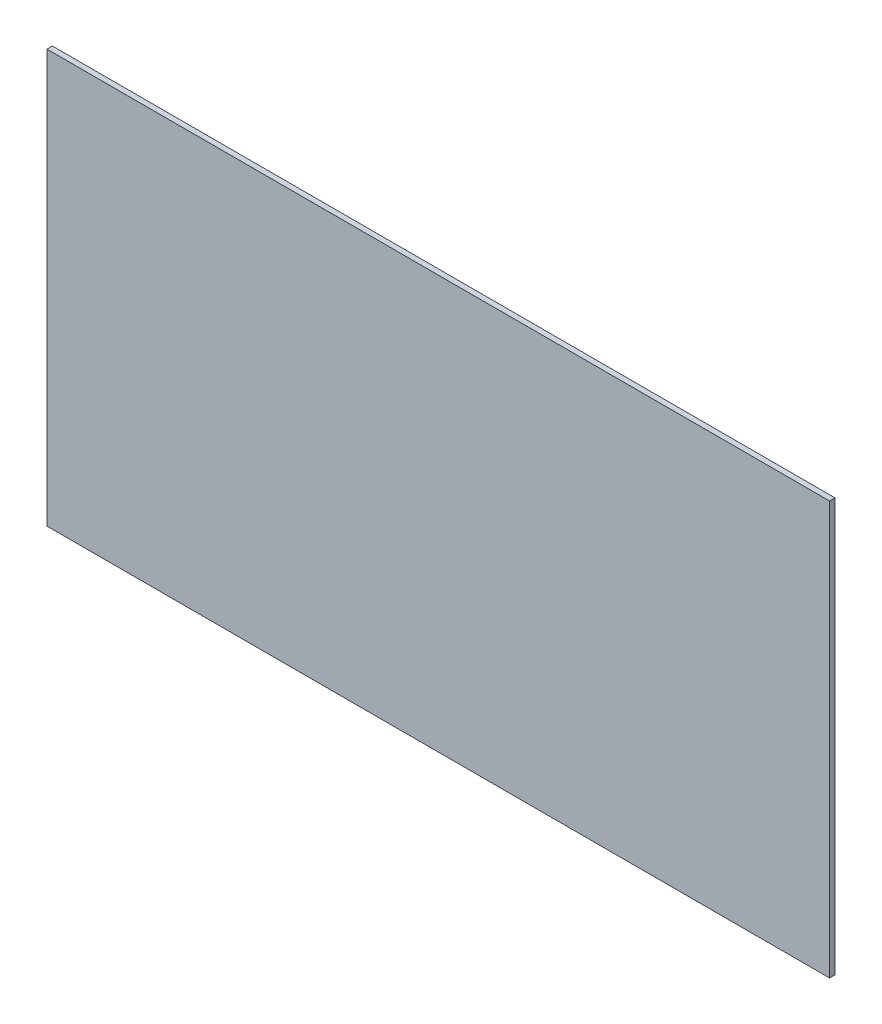
ISO-10303-21;
HEADER;
FILE_DESCRIPTION(('STEP AP214'),'2;1');
FILE_NAME('part.step','',(''),(''),'','','');
FILE_SCHEMA(('AUTOMOTIVE_DESIGN { 1 0 10303 214 1 1 1 1 }'));
ENDSEC;
DATA;
#1=APPLICATION_CONTEXT('core data for automotive mechanical design processes');
#2=APPLICATION_PROTOCOL_DEFINITION('international standard','automotive_design',2000,#1);
#3=PRODUCT_CONTEXT('',#1,'mechanical');
#4=PRODUCT('Part','Part','',(#3));
#5=PRODUCT_RELATED_PRODUCT_CATEGORY('part','',(#4));
#6=PRODUCT_DEFINITION_FORMATION('','',#4);
#7=PRODUCT_DEFINITION_CONTEXT('part definition',#1,'design');
#8=PRODUCT_DEFINITION('design','',#6,#7);
#9=PRODUCT_DEFINITION_SHAPE('','',#8);
#10=(LENGTH_UNIT() NAMED_UNIT(*) SI_UNIT(.MILLI.,.METRE.));
#11=(NAMED_UNIT(*) PLANE_ANGLE_UNIT() SI_UNIT($,.RADIAN.));
#12=(NAMED_UNIT(*) SI_UNIT($,.STERADIAN.) SOLID_ANGLE_UNIT());
#13=UNCERTAINTY_MEASURE_WITH_UNIT(LENGTH_MEASURE(1.E-05),#10,'distance_accuracy_value','');
#14=(GEOMETRIC_REPRESENTATION_CONTEXT(3) GLOBAL_UNCERTAINTY_ASSIGNED_CONTEXT((#13)) GLOBAL_UNIT_ASSIGNED_CONTEXT((#10,
#11,#12)) REPRESENTATION_CONTEXT('',''));
#15=CARTESIAN_POINT('',(0.,0.,0.));
#16=DIRECTION('',(0.,0.,1.));
#17=DIRECTION('',(1.,0.,0.));
#18=AXIS2_PLACEMENT_3D('',#15,#16,#17);
#19=CARTESIAN_POINT('',(0.,0.,6.35));
#20=DIRECTION('',(0.,0.,1.));
#21=DIRECTION('',(1.,0.,0.));
#22=AXIS2_PLACEMENT_3D('',#19,#20,#21);
#23=PLANE('',#22);
#24=DIRECTION('',(1.,0.,0.));
#25=VECTOR('',#24,1.);
#26=CARTESIAN_POINT('',(914.4,482.6,6.35));
#27=LINE('',#26,#25);
#28=CARTESIAN_POINT('',(0.,482.6,6.35));
#29=VERTEX_POINT('',#28);
#30=CARTESIAN_POINT('',(914.4,482.6,6.35));
#31=VERTEX_POINT('',#30);
#32=EDGE_CURVE('E74',#29,#31,#27,.T.);
#33=ORIENTED_EDGE('',*,*,#32,.F.);
#34=DIRECTION('',(0.,1.,0.));
#35=VECTOR('',#34,1.);
#36=CARTESIAN_POINT('',(0.,482.6,6.35));
#37=LINE('',#36,#35);
#38=CARTESIAN_POINT('',(0.,0.,6.35));
#39=VERTEX_POINT('',#38);
#40=EDGE_CURVE('E69',#39,#29,#37,.T.);
#41=ORIENTED_EDGE('',*,*,#40,.F.);
#42=DIRECTION('',(1.,0.,0.));
#43=VECTOR('',#42,1.);
#44=CARTESIAN_POINT('',(0.,0.,6.35));
#45=LINE('',#44,#43);
#46=CARTESIAN_POINT('',(914.4,0.,6.35));
#47=VERTEX_POINT('',#46);
#48=EDGE_CURVE('E84',#47,#39,#45,.F.);
#49=ORIENTED_EDGE('',*,*,#48,.F.);
#50=DIRECTION('',(0.,1.,0.));
#51=VECTOR('',#50,1.);
#52=CARTESIAN_POINT('',(914.4,0.,6.35));
#53=LINE('',#52,#51);
#54=EDGE_CURVE('E36',#31,#47,#53,.F.);
#55=ORIENTED_EDGE('',*,*,#54,.F.);
#56=EDGE_LOOP('',(#33,#41,#49,#55));
#57=FACE_BOUND('',#56,.T.);
#58=ADVANCED_FACE('F33',(#57),#23,.T.);
#59=CARTESIAN_POINT('',(914.4,0.,0.));
#60=DIRECTION('',(1.,0.,0.));
#61=DIRECTION('',(0.,0.,-1.));
#62=AXIS2_PLACEMENT_3D('',#59,#60,#61);
#63=PLANE('',#62);
#64=ORIENTED_EDGE('',*,*,#54,.T.);
#65=DIRECTION('',(0.,0.,-1.));
#66=VECTOR('',#65,1.);
#67=CARTESIAN_POINT('',(914.4,0.,0.));
#68=LINE('',#67,#66);
#69=CARTESIAN_POINT('',(914.4,0.,0.));
#70=VERTEX_POINT('',#69);
#71=EDGE_CURVE('E95',#70,#47,#68,.F.);
#72=ORIENTED_EDGE('',*,*,#71,.F.);
#73=DIRECTION('',(0.,1.,0.));
#74=VECTOR('',#73,1.);
#75=CARTESIAN_POINT('',(914.4,0.,0.));
#76=LINE('',#75,#74);
#77=CARTESIAN_POINT('',(914.4,482.6,0.));
#78=VERTEX_POINT('',#77);
#79=EDGE_CURVE('E90',#70,#78,#76,.T.);
#80=ORIENTED_EDGE('',*,*,#79,.T.);
#81=DIRECTION('',(0.,0.,1.));
#82=VECTOR('',#81,1.);
#83=CARTESIAN_POINT('',(914.4,482.6,0.));
#84=LINE('',#83,#82);
#85=EDGE_CURVE('E79',#31,#78,#84,.F.);
#86=ORIENTED_EDGE('',*,*,#85,.F.);
#87=EDGE_LOOP('',(#64,#72,#80,#86));
#88=FACE_BOUND('',#87,.T.);
#89=ADVANCED_FACE('F89',(#88),#63,.T.);
#90=CARTESIAN_POINT('',(914.4,482.6,0.));
#91=DIRECTION('',(0.,1.,0.));
#92=DIRECTION('',(0.,0.,1.));
#93=AXIS2_PLACEMENT_3D('',#90,#91,#92);
#94=PLANE('',#93);
#95=ORIENTED_EDGE('',*,*,#32,.T.);
#96=ORIENTED_EDGE('',*,*,#85,.T.);
#97=DIRECTION('',(1.,0.,0.));
#98=VECTOR('',#97,1.);
#99=CARTESIAN_POINT('',(0.,482.6,0.));
#100=LINE('',#99,#98);
#101=CARTESIAN_POINT('',(0.,482.6,0.));
#102=VERTEX_POINT('',#101);
#103=EDGE_CURVE('E100',#78,#102,#100,.F.);
#104=ORIENTED_EDGE('',*,*,#103,.T.);
#105=DIRECTION('',(0.,0.,1.));
#106=VECTOR('',#105,1.);
#107=CARTESIAN_POINT('',(0.,482.6,0.));
#108=LINE('',#107,#106);
#109=EDGE_CURVE('E81',#29,#102,#108,.F.);
#110=ORIENTED_EDGE('',*,*,#109,.F.);
#111=EDGE_LOOP('',(#95,#96,#104,#110));
#112=FACE_BOUND('',#111,.T.);
#113=ADVANCED_FACE('F76',(#112),#94,.T.);
#114=CARTESIAN_POINT('',(0.,482.6,0.));
#115=DIRECTION('',(-1.,0.,0.));
#116=DIRECTION('',(0.,0.,1.));
#117=AXIS2_PLACEMENT_3D('',#114,#115,#116);
#118=PLANE('',#117);
#119=ORIENTED_EDGE('',*,*,#40,.T.);
#120=ORIENTED_EDGE('',*,*,#109,.T.);
#121=DIRECTION('',(0.,1.,0.));
#122=VECTOR('',#121,1.);
#123=CARTESIAN_POINT('',(0.,0.,0.));
#124=LINE('',#123,#122);
#125=CARTESIAN_POINT('',(0.,0.,0.));
#126=VERTEX_POINT('',#125);
#127=EDGE_CURVE('E42',#102,#126,#124,.F.);
#128=ORIENTED_EDGE('',*,*,#127,.T.);
#129=DIRECTION('',(0.,0.,-1.));
#130=VECTOR('',#129,1.);
#131=CARTESIAN_POINT('',(0.,0.,0.));
#132=LINE('',#131,#130);
#133=EDGE_CURVE('E50',#39,#126,#132,.T.);
#134=ORIENTED_EDGE('',*,*,#133,.F.);
#135=EDGE_LOOP('',(#119,#120,#128,#134));
#136=FACE_BOUND('',#135,.T.);
#137=ADVANCED_FACE('F104',(#136),#118,.T.);
#138=CARTESIAN_POINT('',(0.,0.,0.));
#139=DIRECTION('',(0.,-1.,0.));
#140=DIRECTION('',(0.,0.,-1.));
#141=AXIS2_PLACEMENT_3D('',#138,#139,#140);
#142=PLANE('',#141);
#143=ORIENTED_EDGE('',*,*,#48,.T.);
#144=ORIENTED_EDGE('',*,*,#133,.T.);
#145=DIRECTION('',(1.,0.,0.));
#146=VECTOR('',#145,1.);
#147=CARTESIAN_POINT('',(0.,0.,0.));
#148=LINE('',#147,#146);
#149=EDGE_CURVE('E11',#126,#70,#148,.T.);
#150=ORIENTED_EDGE('',*,*,#149,.T.);
#151=ORIENTED_EDGE('',*,*,#71,.T.);
#152=EDGE_LOOP('',(#143,#144,#150,#151));
#153=FACE_BOUND('',#152,.T.);
#154=ADVANCED_FACE('F107',(#153),#142,.T.);
#155=CARTESIAN_POINT('',(0.,0.,0.));
#156=DIRECTION('',(0.,0.,1.));
#157=DIRECTION('',(1.,0.,0.));
#158=AXIS2_PLACEMENT_3D('',#155,#156,#157);
#159=PLANE('',#158);
#160=ORIENTED_EDGE('',*,*,#127,.F.);
#161=ORIENTED_EDGE('',*,*,#103,.F.);
#162=ORIENTED_EDGE('',*,*,#79,.F.);
#163=ORIENTED_EDGE('',*,*,#149,.F.);
#164=EDGE_LOOP('',(#160,#161,#162,#163));
#165=FACE_BOUND('',#164,.T.);
#166=ADVANCED_FACE('F106',(#165),#159,.F.);
#167=CLOSED_SHELL('',(#58,#89,#113,#137,#154,#166));
#168=MANIFOLD_SOLID_BREP('B2',#167);
#169=ADVANCED_BREP_SHAPE_REPRESENTATION('',(#18,#168),#14);
#170=SHAPE_DEFINITION_REPRESENTATION(#9,#169);
ENDSEC;
END-ISO-10303-21;
